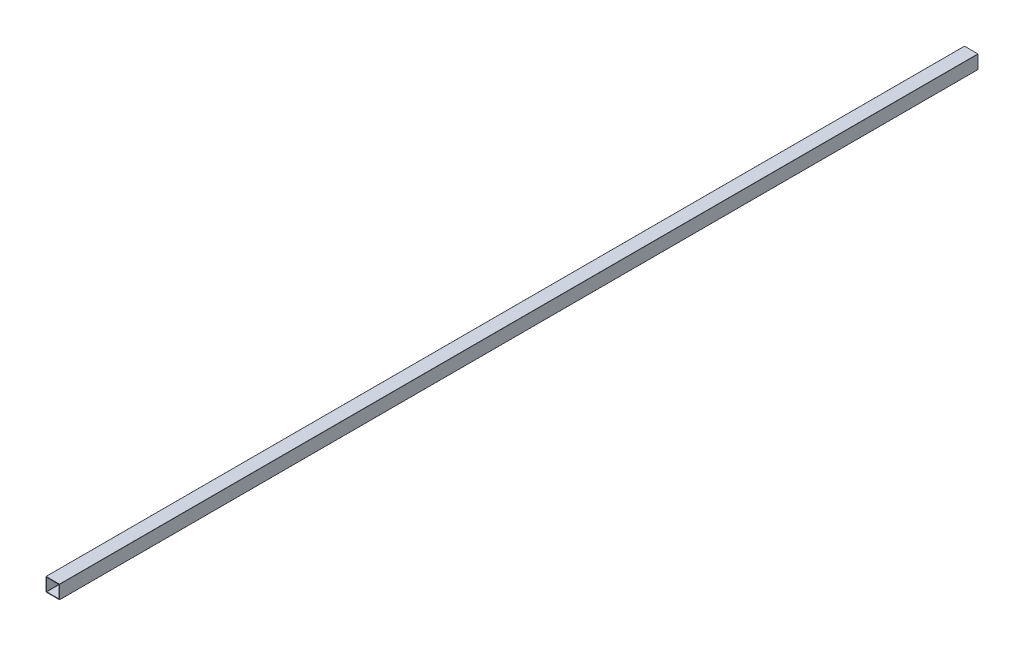
ISO-10303-21;
HEADER;
FILE_DESCRIPTION(('STEP AP214'),'2;1');
FILE_NAME('part.step','',(''),(''),'','','');
FILE_SCHEMA(('AUTOMOTIVE_DESIGN { 1 0 10303 214 1 1 1 1 }'));
ENDSEC;
DATA;
#1=APPLICATION_CONTEXT('core data for automotive mechanical design processes');
#2=APPLICATION_PROTOCOL_DEFINITION('international standard','automotive_design',2000,#1);
#3=PRODUCT_CONTEXT('',#1,'mechanical');
#4=PRODUCT('Part','Part','',(#3));
#5=PRODUCT_RELATED_PRODUCT_CATEGORY('part','',(#4));
#6=PRODUCT_DEFINITION_FORMATION('','',#4);
#7=PRODUCT_DEFINITION_CONTEXT('part definition',#1,'design');
#8=PRODUCT_DEFINITION('design','',#6,#7);
#9=PRODUCT_DEFINITION_SHAPE('','',#8);
#10=(LENGTH_UNIT() NAMED_UNIT(*) SI_UNIT(.MILLI.,.METRE.));
#11=(NAMED_UNIT(*) PLANE_ANGLE_UNIT() SI_UNIT($,.RADIAN.));
#12=(NAMED_UNIT(*) SI_UNIT($,.STERADIAN.) SOLID_ANGLE_UNIT());
#13=UNCERTAINTY_MEASURE_WITH_UNIT(LENGTH_MEASURE(1.E-05),#10,'distance_accuracy_value','');
#14=(GEOMETRIC_REPRESENTATION_CONTEXT(3) GLOBAL_UNCERTAINTY_ASSIGNED_CONTEXT((#13)) GLOBAL_UNIT_ASSIGNED_CONTEXT((#10,
#11,#12)) REPRESENTATION_CONTEXT('',''));
#15=CARTESIAN_POINT('',(0.,0.,0.));
#16=DIRECTION('',(0.,0.,1.));
#17=DIRECTION('',(1.,0.,0.));
#18=AXIS2_PLACEMENT_3D('',#15,#16,#17);
#19=CARTESIAN_POINT('',(44.45,-44.45,-6000.));
#20=DIRECTION('',(1.,0.,0.));
#21=DIRECTION('',(0.,0.,-1.));
#22=AXIS2_PLACEMENT_3D('',#19,#20,#21);
#23=PLANE('',#22);
#24=DIRECTION('',(0.,1.,0.));
#25=VECTOR('',#24,1.);
#26=CARTESIAN_POINT('',(44.45,-44.45,0.));
#27=LINE('',#26,#25);
#28=CARTESIAN_POINT('',(44.45,-43.45,0.));
#29=VERTEX_POINT('',#28);
#30=CARTESIAN_POINT('',(44.45,43.45,0.));
#31=VERTEX_POINT('',#30);
#32=EDGE_CURVE('E197',#29,#31,#27,.T.);
#33=ORIENTED_EDGE('',*,*,#32,.F.);
#34=DIRECTION('',(0.,0.,1.));
#35=VECTOR('',#34,1.);
#36=CARTESIAN_POINT('',(44.45,-43.45,-6000.));
#37=LINE('',#36,#35);
#38=CARTESIAN_POINT('',(44.45,-43.45,-6000.));
#39=VERTEX_POINT('',#38);
#40=EDGE_CURVE('E158',#29,#39,#37,.F.);
#41=ORIENTED_EDGE('',*,*,#40,.T.);
#42=DIRECTION('',(0.,1.,0.));
#43=VECTOR('',#42,1.);
#44=CARTESIAN_POINT('',(44.45,-44.45,-6000.));
#45=LINE('',#44,#43);
#46=CARTESIAN_POINT('',(44.45,43.45,-6000.));
#47=VERTEX_POINT('',#46);
#48=EDGE_CURVE('E185',#39,#47,#45,.T.);
#49=ORIENTED_EDGE('',*,*,#48,.T.);
#50=DIRECTION('',(0.,0.,1.));
#51=VECTOR('',#50,1.);
#52=CARTESIAN_POINT('',(44.45,43.45,-6000.));
#53=LINE('',#52,#51);
#54=EDGE_CURVE('E251',#47,#31,#53,.T.);
#55=ORIENTED_EDGE('',*,*,#54,.T.);
#56=EDGE_LOOP('',(#33,#41,#49,#55));
#57=FACE_BOUND('',#56,.T.);
#58=ADVANCED_FACE('F33',(#57),#23,.T.);
#59=CARTESIAN_POINT('',(-44.45,-44.45,-6000.));
#60=DIRECTION('',(0.,-1.,0.));
#61=DIRECTION('',(0.,0.,-1.));
#62=AXIS2_PLACEMENT_3D('',#59,#60,#61);
#63=PLANE('',#62);
#64=DIRECTION('',(1.,0.,0.));
#65=VECTOR('',#64,1.);
#66=CARTESIAN_POINT('',(-44.45,-44.45,0.));
#67=LINE('',#66,#65);
#68=CARTESIAN_POINT('',(-43.45,-44.45,0.));
#69=VERTEX_POINT('',#68);
#70=CARTESIAN_POINT('',(43.45,-44.45,0.));
#71=VERTEX_POINT('',#70);
#72=EDGE_CURVE('E189',#69,#71,#67,.T.);
#73=ORIENTED_EDGE('',*,*,#72,.F.);
#74=DIRECTION('',(0.,0.,1.));
#75=VECTOR('',#74,1.);
#76=CARTESIAN_POINT('',(-43.45,-44.45,-6000.));
#77=LINE('',#76,#75);
#78=CARTESIAN_POINT('',(-43.45,-44.45,-6000.));
#79=VERTEX_POINT('',#78);
#80=EDGE_CURVE('E238',#69,#79,#77,.F.);
#81=ORIENTED_EDGE('',*,*,#80,.T.);
#82=DIRECTION('',(1.,0.,0.));
#83=VECTOR('',#82,1.);
#84=CARTESIAN_POINT('',(-44.45,-44.45,-6000.));
#85=LINE('',#84,#83);
#86=CARTESIAN_POINT('',(43.45,-44.45,-6000.));
#87=VERTEX_POINT('',#86);
#88=EDGE_CURVE('E194',#79,#87,#85,.T.);
#89=ORIENTED_EDGE('',*,*,#88,.T.);
#90=DIRECTION('',(0.,0.,1.));
#91=VECTOR('',#90,1.);
#92=CARTESIAN_POINT('',(43.45,-44.45,-6000.));
#93=LINE('',#92,#91);
#94=EDGE_CURVE('E235',#87,#71,#93,.T.);
#95=ORIENTED_EDGE('',*,*,#94,.T.);
#96=EDGE_LOOP('',(#73,#81,#89,#95));
#97=FACE_BOUND('',#96,.T.);
#98=ADVANCED_FACE('F305',(#97),#63,.T.);
#99=CARTESIAN_POINT('',(-44.45,-44.45,-6000.));
#100=DIRECTION('',(-1.,0.,0.));
#101=DIRECTION('',(0.,0.,1.));
#102=AXIS2_PLACEMENT_3D('',#99,#100,#101);
#103=PLANE('',#102);
#104=DIRECTION('',(0.,-1.,0.));
#105=VECTOR('',#104,1.);
#106=CARTESIAN_POINT('',(-44.45,-44.45,-6000.));
#107=LINE('',#106,#105);
#108=CARTESIAN_POINT('',(-44.45,43.45,-6000.));
#109=VERTEX_POINT('',#108);
#110=CARTESIAN_POINT('',(-44.45,-43.45,-6000.));
#111=VERTEX_POINT('',#110);
#112=EDGE_CURVE('E191',#109,#111,#107,.T.);
#113=ORIENTED_EDGE('',*,*,#112,.T.);
#114=DIRECTION('',(0.,0.,1.));
#115=VECTOR('',#114,1.);
#116=CARTESIAN_POINT('',(-44.45,-43.45,-6000.));
#117=LINE('',#116,#115);
#118=CARTESIAN_POINT('',(-44.45,-43.45,0.));
#119=VERTEX_POINT('',#118);
#120=EDGE_CURVE('E224',#111,#119,#117,.T.);
#121=ORIENTED_EDGE('',*,*,#120,.T.);
#122=DIRECTION('',(0.,-1.,0.));
#123=VECTOR('',#122,1.);
#124=CARTESIAN_POINT('',(-44.45,-44.45,0.));
#125=LINE('',#124,#123);
#126=CARTESIAN_POINT('',(-44.45,43.45,0.));
#127=VERTEX_POINT('',#126);
#128=EDGE_CURVE('E203',#127,#119,#125,.T.);
#129=ORIENTED_EDGE('',*,*,#128,.F.);
#130=DIRECTION('',(0.,0.,1.));
#131=VECTOR('',#130,1.);
#132=CARTESIAN_POINT('',(-44.45,43.45,-6000.));
#133=LINE('',#132,#131);
#134=EDGE_CURVE('E222',#127,#109,#133,.F.);
#135=ORIENTED_EDGE('',*,*,#134,.T.);
#136=EDGE_LOOP('',(#113,#121,#129,#135));
#137=FACE_BOUND('',#136,.T.);
#138=ADVANCED_FACE('F311',(#137),#103,.T.);
#139=CARTESIAN_POINT('',(-44.45,44.45,-6000.));
#140=DIRECTION('',(0.,1.,0.));
#141=DIRECTION('',(0.,0.,1.));
#142=AXIS2_PLACEMENT_3D('',#139,#140,#141);
#143=PLANE('',#142);
#144=DIRECTION('',(-1.,0.,0.));
#145=VECTOR('',#144,1.);
#146=CARTESIAN_POINT('',(-44.45,44.45,-6000.));
#147=LINE('',#146,#145);
#148=CARTESIAN_POINT('',(43.45,44.45,-6000.));
#149=VERTEX_POINT('',#148);
#150=CARTESIAN_POINT('',(-43.45,44.45,-6000.));
#151=VERTEX_POINT('',#150);
#152=EDGE_CURVE('E188',#149,#151,#147,.T.);
#153=ORIENTED_EDGE('',*,*,#152,.T.);
#154=DIRECTION('',(0.,0.,1.));
#155=VECTOR('',#154,1.);
#156=CARTESIAN_POINT('',(-43.45,44.45,-6000.));
#157=LINE('',#156,#155);
#158=CARTESIAN_POINT('',(-43.45,44.45,0.));
#159=VERTEX_POINT('',#158);
#160=EDGE_CURVE('E248',#151,#159,#157,.T.);
#161=ORIENTED_EDGE('',*,*,#160,.T.);
#162=DIRECTION('',(-1.,0.,0.));
#163=VECTOR('',#162,1.);
#164=CARTESIAN_POINT('',(-44.45,44.45,0.));
#165=LINE('',#164,#163);
#166=CARTESIAN_POINT('',(43.45,44.45,0.));
#167=VERTEX_POINT('',#166);
#168=EDGE_CURVE('E200',#167,#159,#165,.T.);
#169=ORIENTED_EDGE('',*,*,#168,.F.);
#170=DIRECTION('',(0.,0.,1.));
#171=VECTOR('',#170,1.);
#172=CARTESIAN_POINT('',(43.45,44.45,-6000.));
#173=LINE('',#172,#171);
#174=EDGE_CURVE('E55',#167,#149,#173,.F.);
#175=ORIENTED_EDGE('',*,*,#174,.T.);
#176=EDGE_LOOP('',(#153,#161,#169,#175));
#177=FACE_BOUND('',#176,.T.);
#178=ADVANCED_FACE('F316',(#177),#143,.T.);
#179=CARTESIAN_POINT('',(0.,0.,-6000.));
#180=DIRECTION('',(0.,0.,-1.));
#181=DIRECTION('',(-1.,0.,0.));
#182=AXIS2_PLACEMENT_3D('',#179,#180,#181);
#183=PLANE('',#182);
#184=DIRECTION('',(0.,-1.,0.));
#185=VECTOR('',#184,1.);
#186=CARTESIAN_POINT('',(-40.65,-40.65,-6000.));
#187=LINE('',#186,#185);
#188=CARTESIAN_POINT('',(-40.65,39.65,-6000.));
#189=VERTEX_POINT('',#188);
#190=CARTESIAN_POINT('',(-40.65,-39.65,-6000.));
#191=VERTEX_POINT('',#190);
#192=EDGE_CURVE('E167',#189,#191,#187,.T.);
#193=ORIENTED_EDGE('',*,*,#192,.T.);
#194=CARTESIAN_POINT('',(-39.65,-39.65,-6000.));
#195=DIRECTION('',(0.,0.,-1.));
#196=DIRECTION('',(-1.,0.,0.));
#197=AXIS2_PLACEMENT_3D('',#194,#195,#196);
#198=CIRCLE('',#197,1.);
#199=CARTESIAN_POINT('',(-39.65,-40.65,-6000.));
#200=VERTEX_POINT('',#199);
#201=EDGE_CURVE('E11',#191,#200,#198,.F.);
#202=ORIENTED_EDGE('',*,*,#201,.T.);
#203=DIRECTION('',(1.,0.,0.));
#204=VECTOR('',#203,1.);
#205=CARTESIAN_POINT('',(-40.65,-40.65,-6000.));
#206=LINE('',#205,#204);
#207=CARTESIAN_POINT('',(39.65,-40.65,-6000.));
#208=VERTEX_POINT('',#207);
#209=EDGE_CURVE('E175',#200,#208,#206,.T.);
#210=ORIENTED_EDGE('',*,*,#209,.T.);
#211=CARTESIAN_POINT('',(39.65,-39.65,-6000.));
#212=DIRECTION('',(0.,0.,-1.));
#213=DIRECTION('',(-1.,0.,0.));
#214=AXIS2_PLACEMENT_3D('',#211,#212,#213);
#215=CIRCLE('',#214,1.);
#216=CARTESIAN_POINT('',(40.65,-39.65,-6000.));
#217=VERTEX_POINT('',#216);
#218=EDGE_CURVE('E262',#208,#217,#215,.F.);
#219=ORIENTED_EDGE('',*,*,#218,.T.);
#220=DIRECTION('',(0.,1.,0.));
#221=VECTOR('',#220,1.);
#222=CARTESIAN_POINT('',(40.65,-40.65,-6000.));
#223=LINE('',#222,#221);
#224=CARTESIAN_POINT('',(40.65,39.65,-6000.));
#225=VERTEX_POINT('',#224);
#226=EDGE_CURVE('E179',#217,#225,#223,.T.);
#227=ORIENTED_EDGE('',*,*,#226,.T.);
#228=CARTESIAN_POINT('',(39.65,39.65,-6000.));
#229=DIRECTION('',(0.,0.,-1.));
#230=DIRECTION('',(-1.,0.,0.));
#231=AXIS2_PLACEMENT_3D('',#228,#229,#230);
#232=CIRCLE('',#231,1.);
#233=CARTESIAN_POINT('',(39.65,40.65,-6000.));
#234=VERTEX_POINT('',#233);
#235=EDGE_CURVE('E258',#225,#234,#232,.F.);
#236=ORIENTED_EDGE('',*,*,#235,.T.);
#237=DIRECTION('',(-1.,0.,0.));
#238=VECTOR('',#237,1.);
#239=CARTESIAN_POINT('',(-40.65,40.65,-6000.));
#240=LINE('',#239,#238);
#241=CARTESIAN_POINT('',(-39.65,40.65,-6000.));
#242=VERTEX_POINT('',#241);
#243=EDGE_CURVE('E277',#234,#242,#240,.T.);
#244=ORIENTED_EDGE('',*,*,#243,.T.);
#245=CARTESIAN_POINT('',(-39.65,39.65,-6000.));
#246=DIRECTION('',(0.,0.,-1.));
#247=DIRECTION('',(-1.,0.,0.));
#248=AXIS2_PLACEMENT_3D('',#245,#246,#247);
#249=CIRCLE('',#248,1.);
#250=EDGE_CURVE('E157',#242,#189,#249,.F.);
#251=ORIENTED_EDGE('',*,*,#250,.T.);
#252=EDGE_LOOP('',(#193,#202,#210,#219,#227,#236,#244,#251));
#253=FACE_BOUND('',#252,.T.);
#254=ORIENTED_EDGE('',*,*,#88,.F.);
#255=CARTESIAN_POINT('',(-43.45,-43.45,-6000.));
#256=DIRECTION('',(0.,0.,-1.));
#257=DIRECTION('',(-1.,0.,0.));
#258=AXIS2_PLACEMENT_3D('',#255,#256,#257);
#259=CIRCLE('',#258,1.);
#260=EDGE_CURVE('E245',#79,#111,#259,.T.);
#261=ORIENTED_EDGE('',*,*,#260,.T.);
#262=ORIENTED_EDGE('',*,*,#112,.F.);
#263=CARTESIAN_POINT('',(-43.45,43.45,-6000.));
#264=DIRECTION('',(0.,0.,-1.));
#265=DIRECTION('',(-1.,0.,0.));
#266=AXIS2_PLACEMENT_3D('',#263,#264,#265);
#267=CIRCLE('',#266,1.);
#268=EDGE_CURVE('E48',#109,#151,#267,.T.);
#269=ORIENTED_EDGE('',*,*,#268,.T.);
#270=ORIENTED_EDGE('',*,*,#152,.F.);
#271=CARTESIAN_POINT('',(43.45,43.45,-6000.));
#272=DIRECTION('',(0.,0.,-1.));
#273=DIRECTION('',(-1.,0.,0.));
#274=AXIS2_PLACEMENT_3D('',#271,#272,#273);
#275=CIRCLE('',#274,1.);
#276=EDGE_CURVE('E240',#149,#47,#275,.T.);
#277=ORIENTED_EDGE('',*,*,#276,.T.);
#278=ORIENTED_EDGE('',*,*,#48,.F.);
#279=CARTESIAN_POINT('',(43.45,-43.45,-6000.));
#280=DIRECTION('',(0.,0.,-1.));
#281=DIRECTION('',(-1.,0.,0.));
#282=AXIS2_PLACEMENT_3D('',#279,#280,#281);
#283=CIRCLE('',#282,1.);
#284=EDGE_CURVE('E242',#39,#87,#283,.T.);
#285=ORIENTED_EDGE('',*,*,#284,.T.);
#286=EDGE_LOOP('',(#254,#261,#262,#269,#270,#277,#278,#285));
#287=FACE_BOUND('',#286,.T.);
#288=ADVANCED_FACE('F267',(#253,#287),#183,.T.);
#289=CARTESIAN_POINT('',(0.,0.,0.));
#290=DIRECTION('',(0.,0.,-1.));
#291=DIRECTION('',(-1.,0.,0.));
#292=AXIS2_PLACEMENT_3D('',#289,#290,#291);
#293=PLANE('',#292);
#294=DIRECTION('',(0.,1.,0.));
#295=VECTOR('',#294,1.);
#296=CARTESIAN_POINT('',(40.65,-40.65,0.));
#297=LINE('',#296,#295);
#298=CARTESIAN_POINT('',(40.65,-39.65,0.));
#299=VERTEX_POINT('',#298);
#300=CARTESIAN_POINT('',(40.65,39.65,0.));
#301=VERTEX_POINT('',#300);
#302=EDGE_CURVE('E181',#299,#301,#297,.T.);
#303=ORIENTED_EDGE('',*,*,#302,.F.);
#304=CARTESIAN_POINT('',(39.65,-39.65,0.));
#305=DIRECTION('',(0.,0.,-1.));
#306=DIRECTION('',(-1.,0.,0.));
#307=AXIS2_PLACEMENT_3D('',#304,#305,#306);
#308=CIRCLE('',#307,1.);
#309=CARTESIAN_POINT('',(39.65,-40.65,0.));
#310=VERTEX_POINT('',#309);
#311=EDGE_CURVE('E260',#299,#310,#308,.T.);
#312=ORIENTED_EDGE('',*,*,#311,.T.);
#313=DIRECTION('',(1.,0.,0.));
#314=VECTOR('',#313,1.);
#315=CARTESIAN_POINT('',(-40.65,-40.65,0.));
#316=LINE('',#315,#314);
#317=CARTESIAN_POINT('',(-39.65,-40.65,0.));
#318=VERTEX_POINT('',#317);
#319=EDGE_CURVE('E281',#318,#310,#316,.T.);
#320=ORIENTED_EDGE('',*,*,#319,.F.);
#321=CARTESIAN_POINT('',(-39.65,-39.65,0.));
#322=DIRECTION('',(0.,0.,-1.));
#323=DIRECTION('',(-1.,0.,0.));
#324=AXIS2_PLACEMENT_3D('',#321,#322,#323);
#325=CIRCLE('',#324,1.);
#326=CARTESIAN_POINT('',(-40.65,-39.65,0.));
#327=VERTEX_POINT('',#326);
#328=EDGE_CURVE('E41',#318,#327,#325,.T.);
#329=ORIENTED_EDGE('',*,*,#328,.T.);
#330=DIRECTION('',(0.,-1.,0.));
#331=VECTOR('',#330,1.);
#332=CARTESIAN_POINT('',(-40.65,-40.65,0.));
#333=LINE('',#332,#331);
#334=CARTESIAN_POINT('',(-40.65,39.65,0.));
#335=VERTEX_POINT('',#334);
#336=EDGE_CURVE('E164',#335,#327,#333,.T.);
#337=ORIENTED_EDGE('',*,*,#336,.F.);
#338=CARTESIAN_POINT('',(-39.65,39.65,0.));
#339=DIRECTION('',(0.,0.,-1.));
#340=DIRECTION('',(-1.,0.,0.));
#341=AXIS2_PLACEMENT_3D('',#338,#339,#340);
#342=CIRCLE('',#341,1.);
#343=CARTESIAN_POINT('',(-39.65,40.65,0.));
#344=VERTEX_POINT('',#343);
#345=EDGE_CURVE('E147',#335,#344,#342,.T.);
#346=ORIENTED_EDGE('',*,*,#345,.T.);
#347=DIRECTION('',(-1.,0.,0.));
#348=VECTOR('',#347,1.);
#349=CARTESIAN_POINT('',(-40.65,40.65,0.));
#350=LINE('',#349,#348);
#351=CARTESIAN_POINT('',(39.65,40.65,0.));
#352=VERTEX_POINT('',#351);
#353=EDGE_CURVE('E176',#352,#344,#350,.T.);
#354=ORIENTED_EDGE('',*,*,#353,.F.);
#355=CARTESIAN_POINT('',(39.65,39.65,0.));
#356=DIRECTION('',(0.,0.,-1.));
#357=DIRECTION('',(-1.,0.,0.));
#358=AXIS2_PLACEMENT_3D('',#355,#356,#357);
#359=CIRCLE('',#358,1.);
#360=EDGE_CURVE('E256',#352,#301,#359,.T.);
#361=ORIENTED_EDGE('',*,*,#360,.T.);
#362=EDGE_LOOP('',(#303,#312,#320,#329,#337,#346,#354,#361));
#363=FACE_BOUND('',#362,.T.);
#364=ORIENTED_EDGE('',*,*,#128,.T.);
#365=CARTESIAN_POINT('',(-43.45,-43.45,0.));
#366=DIRECTION('',(0.,0.,-1.));
#367=DIRECTION('',(-1.,0.,0.));
#368=AXIS2_PLACEMENT_3D('',#365,#366,#367);
#369=CIRCLE('',#368,1.);
#370=EDGE_CURVE('E233',#119,#69,#369,.F.);
#371=ORIENTED_EDGE('',*,*,#370,.T.);
#372=ORIENTED_EDGE('',*,*,#72,.T.);
#373=CARTESIAN_POINT('',(43.45,-43.45,0.));
#374=DIRECTION('',(0.,0.,-1.));
#375=DIRECTION('',(-1.,0.,0.));
#376=AXIS2_PLACEMENT_3D('',#373,#374,#375);
#377=CIRCLE('',#376,1.);
#378=EDGE_CURVE('E229',#71,#29,#377,.F.);
#379=ORIENTED_EDGE('',*,*,#378,.T.);
#380=ORIENTED_EDGE('',*,*,#32,.T.);
#381=CARTESIAN_POINT('',(43.45,43.45,0.));
#382=DIRECTION('',(0.,0.,-1.));
#383=DIRECTION('',(-1.,0.,0.));
#384=AXIS2_PLACEMENT_3D('',#381,#382,#383);
#385=CIRCLE('',#384,1.);
#386=EDGE_CURVE('E227',#31,#167,#385,.F.);
#387=ORIENTED_EDGE('',*,*,#386,.T.);
#388=ORIENTED_EDGE('',*,*,#168,.T.);
#389=CARTESIAN_POINT('',(-43.45,43.45,0.));
#390=DIRECTION('',(0.,0.,-1.));
#391=DIRECTION('',(-1.,0.,0.));
#392=AXIS2_PLACEMENT_3D('',#389,#390,#391);
#393=CIRCLE('',#392,1.);
#394=EDGE_CURVE('E231',#159,#127,#393,.F.);
#395=ORIENTED_EDGE('',*,*,#394,.T.);
#396=EDGE_LOOP('',(#364,#371,#372,#379,#380,#387,#388,#395));
#397=FACE_BOUND('',#396,.T.);
#398=ADVANCED_FACE('F172',(#363,#397),#293,.F.);
#399=CARTESIAN_POINT('',(-40.65,-40.65,-6000.));
#400=DIRECTION('',(0.,-1.,0.));
#401=DIRECTION('',(0.,0.,-1.));
#402=AXIS2_PLACEMENT_3D('',#399,#400,#401);
#403=PLANE('',#402);
#404=ORIENTED_EDGE('',*,*,#319,.T.);
#405=DIRECTION('',(0.,0.,1.));
#406=VECTOR('',#405,1.);
#407=CARTESIAN_POINT('',(39.65,-40.65,-6000.));
#408=LINE('',#407,#406);
#409=EDGE_CURVE('E220',#310,#208,#408,.F.);
#410=ORIENTED_EDGE('',*,*,#409,.T.);
#411=ORIENTED_EDGE('',*,*,#209,.F.);
#412=DIRECTION('',(0.,0.,1.));
#413=VECTOR('',#412,1.);
#414=CARTESIAN_POINT('',(-39.65,-40.65,0.));
#415=LINE('',#414,#413);
#416=EDGE_CURVE('E217',#200,#318,#415,.T.);
#417=ORIENTED_EDGE('',*,*,#416,.T.);
#418=EDGE_LOOP('',(#404,#410,#411,#417));
#419=FACE_BOUND('',#418,.T.);
#420=ADVANCED_FACE('F283',(#419),#403,.F.);
#421=CARTESIAN_POINT('',(-40.65,-40.65,-6000.));
#422=DIRECTION('',(-1.,0.,0.));
#423=DIRECTION('',(0.,0.,1.));
#424=AXIS2_PLACEMENT_3D('',#421,#422,#423);
#425=PLANE('',#424);
#426=ORIENTED_EDGE('',*,*,#192,.F.);
#427=DIRECTION('',(0.,0.,1.));
#428=VECTOR('',#427,1.);
#429=CARTESIAN_POINT('',(-40.65,39.65,0.));
#430=LINE('',#429,#428);
#431=EDGE_CURVE('E151',#189,#335,#430,.T.);
#432=ORIENTED_EDGE('',*,*,#431,.T.);
#433=ORIENTED_EDGE('',*,*,#336,.T.);
#434=DIRECTION('',(0.,0.,1.));
#435=VECTOR('',#434,1.);
#436=CARTESIAN_POINT('',(-40.65,-39.65,-6000.));
#437=LINE('',#436,#435);
#438=EDGE_CURVE('E169',#327,#191,#437,.F.);
#439=ORIENTED_EDGE('',*,*,#438,.T.);
#440=EDGE_LOOP('',(#426,#432,#433,#439));
#441=FACE_BOUND('',#440,.T.);
#442=ADVANCED_FACE('F163',(#441),#425,.F.);
#443=CARTESIAN_POINT('',(-40.65,40.65,-6000.));
#444=DIRECTION('',(0.,1.,0.));
#445=DIRECTION('',(0.,0.,1.));
#446=AXIS2_PLACEMENT_3D('',#443,#444,#445);
#447=PLANE('',#446);
#448=ORIENTED_EDGE('',*,*,#353,.T.);
#449=DIRECTION('',(0.,0.,1.));
#450=VECTOR('',#449,1.);
#451=CARTESIAN_POINT('',(-39.65,40.65,-6000.));
#452=LINE('',#451,#450);
#453=EDGE_CURVE('E152',#344,#242,#452,.F.);
#454=ORIENTED_EDGE('',*,*,#453,.T.);
#455=ORIENTED_EDGE('',*,*,#243,.F.);
#456=DIRECTION('',(0.,0.,1.));
#457=VECTOR('',#456,1.);
#458=CARTESIAN_POINT('',(39.65,40.65,0.));
#459=LINE('',#458,#457);
#460=EDGE_CURVE('E168',#234,#352,#459,.T.);
#461=ORIENTED_EDGE('',*,*,#460,.T.);
#462=EDGE_LOOP('',(#448,#454,#455,#461));
#463=FACE_BOUND('',#462,.T.);
#464=ADVANCED_FACE('F292',(#463),#447,.F.);
#465=CARTESIAN_POINT('',(40.65,-40.65,-6000.));
#466=DIRECTION('',(1.,0.,0.));
#467=DIRECTION('',(0.,0.,-1.));
#468=AXIS2_PLACEMENT_3D('',#465,#466,#467);
#469=PLANE('',#468);
#470=ORIENTED_EDGE('',*,*,#302,.T.);
#471=DIRECTION('',(0.,0.,1.));
#472=VECTOR('',#471,1.);
#473=CARTESIAN_POINT('',(40.65,39.65,-6000.));
#474=LINE('',#473,#472);
#475=EDGE_CURVE('E215',#301,#225,#474,.F.);
#476=ORIENTED_EDGE('',*,*,#475,.T.);
#477=ORIENTED_EDGE('',*,*,#226,.F.);
#478=DIRECTION('',(0.,0.,1.));
#479=VECTOR('',#478,1.);
#480=CARTESIAN_POINT('',(40.65,-39.65,0.));
#481=LINE('',#480,#479);
#482=EDGE_CURVE('E212',#217,#299,#481,.T.);
#483=ORIENTED_EDGE('',*,*,#482,.T.);
#484=EDGE_LOOP('',(#470,#476,#477,#483));
#485=FACE_BOUND('',#484,.T.);
#486=ADVANCED_FACE('F275',(#485),#469,.F.);
#487=CARTESIAN_POINT('',(-39.65,39.65,-6000.));
#488=DIRECTION('',(0.,0.,-1.));
#489=DIRECTION('',(-1.,0.,0.));
#490=AXIS2_PLACEMENT_3D('',#487,#488,#489);
#491=CYLINDRICAL_SURFACE('',#490,1.);
#492=ORIENTED_EDGE('',*,*,#250,.F.);
#493=ORIENTED_EDGE('',*,*,#453,.F.);
#494=ORIENTED_EDGE('',*,*,#345,.F.);
#495=ORIENTED_EDGE('',*,*,#431,.F.);
#496=EDGE_LOOP('',(#492,#493,#494,#495));
#497=FACE_BOUND('',#496,.T.);
#498=ADVANCED_FACE('F150',(#497),#491,.F.);
#499=CARTESIAN_POINT('',(39.65,39.65,-6000.));
#500=DIRECTION('',(0.,0.,-1.));
#501=DIRECTION('',(-1.,0.,0.));
#502=AXIS2_PLACEMENT_3D('',#499,#500,#501);
#503=CYLINDRICAL_SURFACE('',#502,1.);
#504=ORIENTED_EDGE('',*,*,#235,.F.);
#505=ORIENTED_EDGE('',*,*,#475,.F.);
#506=ORIENTED_EDGE('',*,*,#360,.F.);
#507=ORIENTED_EDGE('',*,*,#460,.F.);
#508=EDGE_LOOP('',(#504,#505,#506,#507));
#509=FACE_BOUND('',#508,.T.);
#510=ADVANCED_FACE('F294',(#509),#503,.F.);
#511=CARTESIAN_POINT('',(39.65,-39.65,-6000.));
#512=DIRECTION('',(0.,0.,-1.));
#513=DIRECTION('',(-1.,0.,0.));
#514=AXIS2_PLACEMENT_3D('',#511,#512,#513);
#515=CYLINDRICAL_SURFACE('',#514,1.);
#516=ORIENTED_EDGE('',*,*,#218,.F.);
#517=ORIENTED_EDGE('',*,*,#409,.F.);
#518=ORIENTED_EDGE('',*,*,#311,.F.);
#519=ORIENTED_EDGE('',*,*,#482,.F.);
#520=EDGE_LOOP('',(#516,#517,#518,#519));
#521=FACE_BOUND('',#520,.T.);
#522=ADVANCED_FACE('F279',(#521),#515,.F.);
#523=CARTESIAN_POINT('',(-43.45,-43.45,-6000.));
#524=DIRECTION('',(0.,0.,1.));
#525=DIRECTION('',(1.,0.,0.));
#526=AXIS2_PLACEMENT_3D('',#523,#524,#525);
#527=CYLINDRICAL_SURFACE('',#526,1.);
#528=ORIENTED_EDGE('',*,*,#260,.F.);
#529=ORIENTED_EDGE('',*,*,#80,.F.);
#530=ORIENTED_EDGE('',*,*,#370,.F.);
#531=ORIENTED_EDGE('',*,*,#120,.F.);
#532=EDGE_LOOP('',(#528,#529,#530,#531));
#533=FACE_BOUND('',#532,.T.);
#534=ADVANCED_FACE('F301',(#533),#527,.T.);
#535=CARTESIAN_POINT('',(-43.45,43.45,-6000.));
#536=DIRECTION('',(0.,0.,1.));
#537=DIRECTION('',(1.,0.,0.));
#538=AXIS2_PLACEMENT_3D('',#535,#536,#537);
#539=CYLINDRICAL_SURFACE('',#538,1.);
#540=ORIENTED_EDGE('',*,*,#268,.F.);
#541=ORIENTED_EDGE('',*,*,#134,.F.);
#542=ORIENTED_EDGE('',*,*,#394,.F.);
#543=ORIENTED_EDGE('',*,*,#160,.F.);
#544=EDGE_LOOP('',(#540,#541,#542,#543));
#545=FACE_BOUND('',#544,.T.);
#546=ADVANCED_FACE('F368',(#545),#539,.T.);
#547=CARTESIAN_POINT('',(-39.65,-39.65,-6000.));
#548=DIRECTION('',(0.,0.,-1.));
#549=DIRECTION('',(-1.,0.,0.));
#550=AXIS2_PLACEMENT_3D('',#547,#548,#549);
#551=CYLINDRICAL_SURFACE('',#550,1.);
#552=ORIENTED_EDGE('',*,*,#201,.F.);
#553=ORIENTED_EDGE('',*,*,#438,.F.);
#554=ORIENTED_EDGE('',*,*,#328,.F.);
#555=ORIENTED_EDGE('',*,*,#416,.F.);
#556=EDGE_LOOP('',(#552,#553,#554,#555));
#557=FACE_BOUND('',#556,.T.);
#558=ADVANCED_FACE('F378',(#557),#551,.F.);
#559=CARTESIAN_POINT('',(43.45,-43.45,-6000.));
#560=DIRECTION('',(0.,0.,1.));
#561=DIRECTION('',(1.,0.,0.));
#562=AXIS2_PLACEMENT_3D('',#559,#560,#561);
#563=CYLINDRICAL_SURFACE('',#562,1.);
#564=ORIENTED_EDGE('',*,*,#284,.F.);
#565=ORIENTED_EDGE('',*,*,#40,.F.);
#566=ORIENTED_EDGE('',*,*,#378,.F.);
#567=ORIENTED_EDGE('',*,*,#94,.F.);
#568=EDGE_LOOP('',(#564,#565,#566,#567));
#569=FACE_BOUND('',#568,.T.);
#570=ADVANCED_FACE('F388',(#569),#563,.T.);
#571=CARTESIAN_POINT('',(43.45,43.45,-6000.));
#572=DIRECTION('',(0.,0.,1.));
#573=DIRECTION('',(1.,0.,0.));
#574=AXIS2_PLACEMENT_3D('',#571,#572,#573);
#575=CYLINDRICAL_SURFACE('',#574,1.);
#576=ORIENTED_EDGE('',*,*,#276,.F.);
#577=ORIENTED_EDGE('',*,*,#174,.F.);
#578=ORIENTED_EDGE('',*,*,#386,.F.);
#579=ORIENTED_EDGE('',*,*,#54,.F.);
#580=EDGE_LOOP('',(#576,#577,#578,#579));
#581=FACE_BOUND('',#580,.T.);
#582=ADVANCED_FACE('F35',(#581),#575,.T.);
#583=CLOSED_SHELL('',(#58,#98,#138,#178,#288,#398,#420,#442,#464,#486,#498,#510,#522,#534,#546,
#558,#570,#582));
#584=MANIFOLD_SOLID_BREP('B2',#583);
#585=ADVANCED_BREP_SHAPE_REPRESENTATION('',(#18,#584),#14);
#586=SHAPE_DEFINITION_REPRESENTATION(#9,#585);
ENDSEC;
END-ISO-10303-21;
